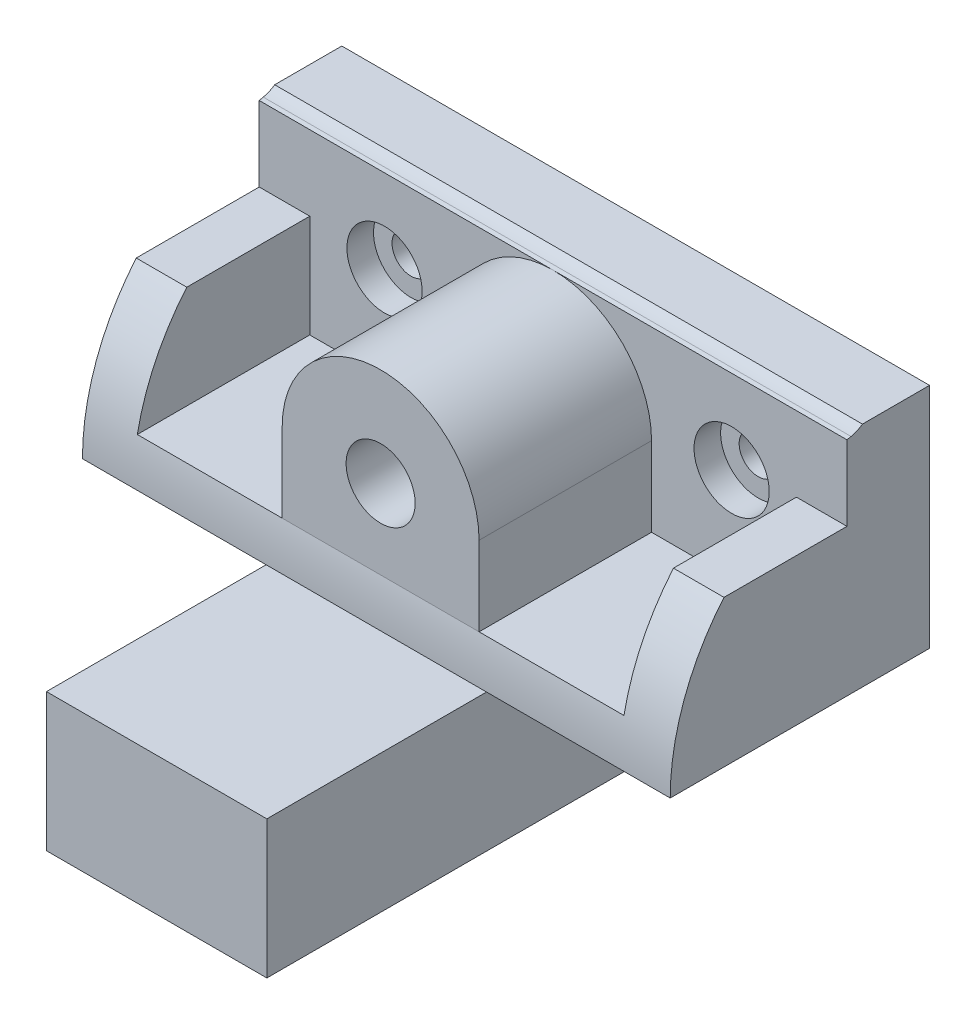
ISO-10303-21;
HEADER;
FILE_DESCRIPTION(('STEP AP214'),'2;1');
FILE_NAME('part.step','',(''),(''),'','','');
FILE_SCHEMA(('AUTOMOTIVE_DESIGN { 1 0 10303 214 1 1 1 1 }'));
ENDSEC;
DATA;
#1=APPLICATION_CONTEXT('core data for automotive mechanical design processes');
#2=APPLICATION_PROTOCOL_DEFINITION('international standard','automotive_design',2000,#1);
#3=PRODUCT_CONTEXT('',#1,'mechanical');
#4=PRODUCT('Part','Part','',(#3));
#5=PRODUCT_RELATED_PRODUCT_CATEGORY('part','',(#4));
#6=PRODUCT_DEFINITION_FORMATION('','',#4);
#7=PRODUCT_DEFINITION_CONTEXT('part definition',#1,'design');
#8=PRODUCT_DEFINITION('design','',#6,#7);
#9=PRODUCT_DEFINITION_SHAPE('','',#8);
#10=(LENGTH_UNIT() NAMED_UNIT(*) SI_UNIT(.MILLI.,.METRE.));
#11=(NAMED_UNIT(*) PLANE_ANGLE_UNIT() SI_UNIT($,.RADIAN.));
#12=(NAMED_UNIT(*) SI_UNIT($,.STERADIAN.) SOLID_ANGLE_UNIT());
#13=UNCERTAINTY_MEASURE_WITH_UNIT(LENGTH_MEASURE(1.E-05),#10,'distance_accuracy_value','');
#14=(GEOMETRIC_REPRESENTATION_CONTEXT(3) GLOBAL_UNCERTAINTY_ASSIGNED_CONTEXT((#13)) GLOBAL_UNIT_ASSIGNED_CONTEXT((#10,
#11,#12)) REPRESENTATION_CONTEXT('',''));
#15=CARTESIAN_POINT('',(0.,0.,0.));
#16=DIRECTION('',(0.,0.,1.));
#17=DIRECTION('',(1.,0.,0.));
#18=AXIS2_PLACEMENT_3D('',#15,#16,#17);
#19=CARTESIAN_POINT('',(101.6,0.,-39.3464684963495));
#20=DIRECTION('',(-1.,0.,0.));
#21=DIRECTION('',(0.,0.,1.));
#22=AXIS2_PLACEMENT_3D('',#19,#20,#21);
#23=CYLINDRICAL_SURFACE('',#22,39.3464684963495);
#24=DIRECTION('',(-1.,0.,0.));
#25=VECTOR('',#24,1.);
#26=CARTESIAN_POINT('',(101.6,25.4,-9.29676661539527));
#27=LINE('',#26,#25);
#28=CARTESIAN_POINT('',(92.8624,25.4,-9.29676661539527));
#29=VERTEX_POINT('',#28);
#30=CARTESIAN_POINT('',(101.6,25.4,-9.29676661539527));
#31=VERTEX_POINT('',#30);
#32=EDGE_CURVE('E475',#29,#31,#27,.F.);
#33=ORIENTED_EDGE('',*,*,#32,.F.);
#34=CARTESIAN_POINT('',(92.8624,0.,-39.3464684963495));
#35=DIRECTION('',(1.,0.,0.));
#36=DIRECTION('',(0.,0.,-1.));
#37=AXIS2_PLACEMENT_3D('',#34,#35,#36);
#38=CIRCLE('',#37,39.3464684963495);
#39=CARTESIAN_POINT('',(92.8624,7.61999999999997,-0.744911751391353));
#40=VERTEX_POINT('',#39);
#41=EDGE_CURVE('E196',#29,#40,#38,.T.);
#42=ORIENTED_EDGE('',*,*,#41,.T.);
#43=DIRECTION('',(-1.,0.,0.));
#44=VECTOR('',#43,1.);
#45=CARTESIAN_POINT('',(101.6,7.61999999999997,-0.744911751391353));
#46=LINE('',#45,#44);
#47=CARTESIAN_POINT('',(67.818,7.61999999999997,-0.744911751391353));
#48=VERTEX_POINT('',#47);
#49=EDGE_CURVE('E254',#40,#48,#46,.T.);
#50=ORIENTED_EDGE('',*,*,#49,.T.);
#51=DIRECTION('',(1.,0.,0.));
#52=VECTOR('',#51,1.);
#53=CARTESIAN_POINT('',(33.782,7.61999999999998,-0.744911751391353));
#54=LINE('',#53,#52);
#55=CARTESIAN_POINT('',(33.782,7.61999999999998,-0.744911751391353));
#56=VERTEX_POINT('',#55);
#57=EDGE_CURVE('E384',#56,#48,#54,.T.);
#58=ORIENTED_EDGE('',*,*,#57,.F.);
#59=CARTESIAN_POINT('',(8.73760000000001,7.61999999999997,-0.744911751391353));
#60=VERTEX_POINT('',#59);
#61=EDGE_CURVE('E256',#56,#60,#46,.T.);
#62=ORIENTED_EDGE('',*,*,#61,.T.);
#63=CARTESIAN_POINT('',(8.73760000000001,0.,-39.3464684963495));
#64=DIRECTION('',(-1.,0.,0.));
#65=DIRECTION('',(0.,0.,1.));
#66=AXIS2_PLACEMENT_3D('',#63,#64,#65);
#67=CIRCLE('',#66,39.3464684963495);
#68=CARTESIAN_POINT('',(8.73760000000001,25.4,-9.29676661539527));
#69=VERTEX_POINT('',#68);
#70=EDGE_CURVE('E246',#60,#69,#67,.T.);
#71=ORIENTED_EDGE('',*,*,#70,.T.);
#72=DIRECTION('',(-1.,0.,0.));
#73=VECTOR('',#72,1.);
#74=CARTESIAN_POINT('',(101.6,25.4,-9.29676661539527));
#75=LINE('',#74,#73);
#76=CARTESIAN_POINT('',(0.,25.4,-9.29676661539527));
#77=VERTEX_POINT('',#76);
#78=EDGE_CURVE('E48',#77,#69,#75,.F.);
#79=ORIENTED_EDGE('',*,*,#78,.F.);
#80=CARTESIAN_POINT('',(0.,0.,-39.3464684963495));
#81=DIRECTION('',(1.,0.,0.));
#82=DIRECTION('',(0.,0.,1.));
#83=AXIS2_PLACEMENT_3D('',#80,#81,#82);
#84=CIRCLE('',#83,39.3464684963495);
#85=CARTESIAN_POINT('',(0.,0.,0.));
#86=VERTEX_POINT('',#85);
#87=EDGE_CURVE('E203',#77,#86,#84,.T.);
#88=ORIENTED_EDGE('',*,*,#87,.T.);
#89=DIRECTION('',(-1.,0.,0.));
#90=VECTOR('',#89,1.);
#91=CARTESIAN_POINT('',(101.6,0.,0.));
#92=LINE('',#91,#90);
#93=CARTESIAN_POINT('',(31.75,0.,0.));
#94=VERTEX_POINT('',#93);
#95=EDGE_CURVE('E245',#94,#86,#92,.T.);
#96=ORIENTED_EDGE('',*,*,#95,.F.);
#97=CARTESIAN_POINT('',(69.85,0.,0.));
#98=VERTEX_POINT('',#97);
#99=EDGE_CURVE('E263',#98,#94,#92,.T.);
#100=ORIENTED_EDGE('',*,*,#99,.F.);
#101=CARTESIAN_POINT('',(101.6,0.,0.));
#102=VERTEX_POINT('',#101);
#103=EDGE_CURVE('E236',#102,#98,#92,.T.);
#104=ORIENTED_EDGE('',*,*,#103,.F.);
#105=CARTESIAN_POINT('',(101.6,0.,-39.3464684963495));
#106=DIRECTION('',(1.,0.,0.));
#107=DIRECTION('',(0.,0.,1.));
#108=AXIS2_PLACEMENT_3D('',#105,#106,#107);
#109=CIRCLE('',#108,39.3464684963495);
#110=EDGE_CURVE('E212',#31,#102,#109,.T.);
#111=ORIENTED_EDGE('',*,*,#110,.F.);
#112=EDGE_LOOP('',(#33,#42,#50,#58,#62,#71,#79,#88,#96,#100,#104,#111));
#113=FACE_BOUND('',#112,.T.);
#114=ADVANCED_FACE('F34',(#113),#23,.T.);
#115=DIRECTION('',(-1.,0.,0.));
#116=VECTOR('',#115,1.);
#117=CARTESIAN_POINT('',(101.6,38.3519981604129,-30.5562));
#118=LINE('',#117,#116);
#119=CARTESIAN_POINT('',(50.8,38.3519981604129,-30.5562));
#120=VERTEX_POINT('',#119);
#121=CARTESIAN_POINT('',(101.6,38.3519981604129,-30.5562000000001));
#122=VERTEX_POINT('',#121);
#123=EDGE_CURVE('E253',#120,#122,#118,.F.);
#124=ORIENTED_EDGE('',*,*,#123,.T.);
#125=CARTESIAN_POINT('',(101.6,38.5064,-31.2593341352654));
#126=VERTEX_POINT('',#125);
#127=EDGE_CURVE('E208',#126,#122,#109,.T.);
#128=ORIENTED_EDGE('',*,*,#127,.F.);
#129=DIRECTION('',(-1.,0.,0.));
#130=VECTOR('',#129,1.);
#131=CARTESIAN_POINT('',(101.6,38.5064,-31.2593341352654));
#132=LINE('',#131,#130);
#133=CARTESIAN_POINT('',(0.,38.5064,-31.2593341352654));
#134=VERTEX_POINT('',#133);
#135=EDGE_CURVE('E219',#126,#134,#132,.T.);
#136=ORIENTED_EDGE('',*,*,#135,.T.);
#137=CARTESIAN_POINT('',(0.,38.3519981604129,-30.5562));
#138=VERTEX_POINT('',#137);
#139=EDGE_CURVE('E220',#134,#138,#84,.T.);
#140=ORIENTED_EDGE('',*,*,#139,.T.);
#141=EDGE_CURVE('E250',#138,#120,#118,.F.);
#142=ORIENTED_EDGE('',*,*,#141,.T.);
#143=EDGE_LOOP('',(#124,#128,#136,#140,#142));
#144=FACE_BOUND('',#143,.T.);
#145=ADVANCED_FACE('F463',(#144),#23,.T.);
#146=CARTESIAN_POINT('',(101.6,0.,-39.3464684963495));
#147=DIRECTION('',(-1.,0.,0.));
#148=DIRECTION('',(0.,0.,1.));
#149=AXIS2_PLACEMENT_3D('',#146,#147,#148);
#150=PLANE('',#149);
#151=DIRECTION('',(0.,0.,1.));
#152=VECTOR('',#151,1.);
#153=CARTESIAN_POINT('',(101.6,25.4,-30.5562000000001));
#154=LINE('',#153,#152);
#155=CARTESIAN_POINT('',(101.6,25.4,-30.5562000000001));
#156=VERTEX_POINT('',#155);
#157=EDGE_CURVE('E183',#156,#31,#154,.T.);
#158=ORIENTED_EDGE('',*,*,#157,.T.);
#159=ORIENTED_EDGE('',*,*,#110,.T.);
#160=DIRECTION('',(0.,0.,-1.));
#161=VECTOR('',#160,1.);
#162=CARTESIAN_POINT('',(101.6,0.,0.));
#163=LINE('',#162,#161);
#164=CARTESIAN_POINT('',(101.6,0.,-44.831));
#165=VERTEX_POINT('',#164);
#166=EDGE_CURVE('E211',#102,#165,#163,.T.);
#167=ORIENTED_EDGE('',*,*,#166,.T.);
#168=DIRECTION('',(0.,1.,0.));
#169=VECTOR('',#168,1.);
#170=CARTESIAN_POINT('',(101.6,0.,-44.831));
#171=LINE('',#170,#169);
#172=CARTESIAN_POINT('',(101.6,39.37,-44.831));
#173=VERTEX_POINT('',#172);
#174=EDGE_CURVE('E214',#165,#173,#171,.T.);
#175=ORIENTED_EDGE('',*,*,#174,.T.);
#176=DIRECTION('',(0.,0.,1.));
#177=VECTOR('',#176,1.);
#178=CARTESIAN_POINT('',(101.6,39.37,-39.3464684963495));
#179=LINE('',#178,#177);
#180=CARTESIAN_POINT('',(101.6,39.37,-33.2291700065132));
#181=VERTEX_POINT('',#180);
#182=EDGE_CURVE('E360',#173,#181,#179,.T.);
#183=ORIENTED_EDGE('',*,*,#182,.T.);
#184=CARTESIAN_POINT('',(101.6,43.6476754525857,-30.1795607632441));
#185=DIRECTION('',(-1.,0.,0.));
#186=DIRECTION('',(0.,0.,-1.));
#187=AXIS2_PLACEMENT_3D('',#184,#185,#186);
#188=CIRCLE('',#187,5.25343923675592);
#189=EDGE_CURVE('E217',#181,#126,#188,.T.);
#190=ORIENTED_EDGE('',*,*,#189,.T.);
#191=ORIENTED_EDGE('',*,*,#127,.T.);
#192=DIRECTION('',(0.,-1.,0.));
#193=VECTOR('',#192,1.);
#194=CARTESIAN_POINT('',(101.6,38.3519981604129,-30.5562));
#195=LINE('',#194,#193);
#196=EDGE_CURVE('E474',#122,#156,#195,.T.);
#197=ORIENTED_EDGE('',*,*,#196,.T.);
#198=EDGE_LOOP('',(#158,#159,#167,#175,#183,#190,#191,#197));
#199=FACE_BOUND('',#198,.T.);
#200=ADVANCED_FACE('F359',(#199),#150,.F.);
#201=CARTESIAN_POINT('',(92.8624,7.61999999999997,0.));
#202=DIRECTION('',(1.,0.,0.));
#203=DIRECTION('',(0.,0.,-1.));
#204=AXIS2_PLACEMENT_3D('',#201,#202,#203);
#205=PLANE('',#204);
#206=DIRECTION('',(0.,0.,1.));
#207=VECTOR('',#206,1.);
#208=CARTESIAN_POINT('',(92.8624,25.4,0.));
#209=LINE('',#208,#207);
#210=CARTESIAN_POINT('',(92.8624,25.4,-30.5562));
#211=VERTEX_POINT('',#210);
#212=EDGE_CURVE('E11',#211,#29,#209,.T.);
#213=ORIENTED_EDGE('',*,*,#212,.F.);
#214=DIRECTION('',(0.,1.,0.));
#215=VECTOR('',#214,1.);
#216=CARTESIAN_POINT('',(92.8624,7.61999999999997,-30.5562));
#217=LINE('',#216,#215);
#218=CARTESIAN_POINT('',(92.8624,7.61999999999997,-30.5562));
#219=VERTEX_POINT('',#218);
#220=EDGE_CURVE('E194',#219,#211,#217,.T.);
#221=ORIENTED_EDGE('',*,*,#220,.F.);
#222=DIRECTION('',(0.,0.,-1.));
#223=VECTOR('',#222,1.);
#224=CARTESIAN_POINT('',(92.8624,7.61999999999997,0.));
#225=LINE('',#224,#223);
#226=EDGE_CURVE('E416',#40,#219,#225,.T.);
#227=ORIENTED_EDGE('',*,*,#226,.F.);
#228=ORIENTED_EDGE('',*,*,#41,.F.);
#229=EDGE_LOOP('',(#213,#221,#227,#228));
#230=FACE_BOUND('',#229,.T.);
#231=ADVANCED_FACE('F192',(#230),#205,.F.);
#232=CARTESIAN_POINT('',(0.,0.,-39.3464684963495));
#233=DIRECTION('',(-1.,0.,0.));
#234=DIRECTION('',(0.,0.,1.));
#235=AXIS2_PLACEMENT_3D('',#232,#233,#234);
#236=PLANE('',#235);
#237=DIRECTION('',(0.,0.,1.));
#238=VECTOR('',#237,1.);
#239=CARTESIAN_POINT('',(0.,25.4,-30.5562));
#240=LINE('',#239,#238);
#241=CARTESIAN_POINT('',(0.,25.4,-30.5562));
#242=VERTEX_POINT('',#241);
#243=EDGE_CURVE('E432',#242,#77,#240,.T.);
#244=ORIENTED_EDGE('',*,*,#243,.F.);
#245=DIRECTION('',(0.,-1.,0.));
#246=VECTOR('',#245,1.);
#247=CARTESIAN_POINT('',(0.,38.3519981604129,-30.5562));
#248=LINE('',#247,#246);
#249=EDGE_CURVE('E435',#138,#242,#248,.T.);
#250=ORIENTED_EDGE('',*,*,#249,.F.);
#251=ORIENTED_EDGE('',*,*,#139,.F.);
#252=CARTESIAN_POINT('',(0.,43.6476754525857,-30.1795607632441));
#253=DIRECTION('',(-1.,0.,0.));
#254=DIRECTION('',(0.,0.,-1.));
#255=AXIS2_PLACEMENT_3D('',#252,#253,#254);
#256=CIRCLE('',#255,5.25343923675592);
#257=CARTESIAN_POINT('',(0.,39.37,-33.2291700065132));
#258=VERTEX_POINT('',#257);
#259=EDGE_CURVE('E229',#258,#134,#256,.T.);
#260=ORIENTED_EDGE('',*,*,#259,.F.);
#261=DIRECTION('',(0.,0.,1.));
#262=VECTOR('',#261,1.);
#263=CARTESIAN_POINT('',(0.,39.37,-44.831));
#264=LINE('',#263,#262);
#265=CARTESIAN_POINT('',(0.,39.37,-44.831));
#266=VERTEX_POINT('',#265);
#267=EDGE_CURVE('E282',#266,#258,#264,.T.);
#268=ORIENTED_EDGE('',*,*,#267,.F.);
#269=DIRECTION('',(0.,1.,0.));
#270=VECTOR('',#269,1.);
#271=CARTESIAN_POINT('',(0.,0.,-44.831));
#272=LINE('',#271,#270);
#273=CARTESIAN_POINT('',(0.,0.,-44.831));
#274=VERTEX_POINT('',#273);
#275=EDGE_CURVE('E226',#274,#266,#272,.T.);
#276=ORIENTED_EDGE('',*,*,#275,.F.);
#277=DIRECTION('',(0.,0.,-1.));
#278=VECTOR('',#277,1.);
#279=CARTESIAN_POINT('',(0.,0.,0.));
#280=LINE('',#279,#278);
#281=EDGE_CURVE('E223',#86,#274,#280,.T.);
#282=ORIENTED_EDGE('',*,*,#281,.F.);
#283=ORIENTED_EDGE('',*,*,#87,.F.);
#284=EDGE_LOOP('',(#244,#250,#251,#260,#268,#276,#282,#283));
#285=FACE_BOUND('',#284,.T.);
#286=ADVANCED_FACE('F280',(#285),#236,.T.);
#287=CARTESIAN_POINT('',(8.73760000000001,7.61999999999997,0.));
#288=DIRECTION('',(-1.,0.,0.));
#289=DIRECTION('',(0.,0.,1.));
#290=AXIS2_PLACEMENT_3D('',#287,#288,#289);
#291=PLANE('',#290);
#292=DIRECTION('',(0.,0.,1.));
#293=VECTOR('',#292,1.);
#294=CARTESIAN_POINT('',(8.73760000000001,25.4,-30.5562));
#295=LINE('',#294,#293);
#296=CARTESIAN_POINT('',(8.73760000000001,25.4,-30.5562));
#297=VERTEX_POINT('',#296);
#298=EDGE_CURVE('E431',#297,#69,#295,.T.);
#299=ORIENTED_EDGE('',*,*,#298,.T.);
#300=ORIENTED_EDGE('',*,*,#70,.F.);
#301=DIRECTION('',(0.,0.,1.));
#302=VECTOR('',#301,1.);
#303=CARTESIAN_POINT('',(8.73760000000001,7.61999999999997,0.));
#304=LINE('',#303,#302);
#305=CARTESIAN_POINT('',(8.73760000000001,7.61999999999997,-30.5562));
#306=VERTEX_POINT('',#305);
#307=EDGE_CURVE('E414',#306,#60,#304,.T.);
#308=ORIENTED_EDGE('',*,*,#307,.F.);
#309=DIRECTION('',(0.,1.,0.));
#310=VECTOR('',#309,1.);
#311=CARTESIAN_POINT('',(8.73760000000001,7.61999999999997,-30.5562));
#312=LINE('',#311,#310);
#313=EDGE_CURVE('E200',#306,#297,#312,.T.);
#314=ORIENTED_EDGE('',*,*,#313,.T.);
#315=EDGE_LOOP('',(#299,#300,#308,#314));
#316=FACE_BOUND('',#315,.T.);
#317=ADVANCED_FACE('F430',(#316),#291,.F.);
#318=CARTESIAN_POINT('',(101.6,0.,0.));
#319=DIRECTION('',(0.,1.,0.));
#320=DIRECTION('',(0.,0.,1.));
#321=AXIS2_PLACEMENT_3D('',#318,#319,#320);
#322=PLANE('',#321);
#323=DIRECTION('',(0.,0.,-1.));
#324=VECTOR('',#323,1.);
#325=CARTESIAN_POINT('',(31.75,0.,37.973));
#326=LINE('',#325,#324);
#327=CARTESIAN_POINT('',(31.75,0.,-44.831));
#328=VERTEX_POINT('',#327);
#329=EDGE_CURVE('E41',#94,#328,#326,.T.);
#330=ORIENTED_EDGE('',*,*,#329,.F.);
#331=ORIENTED_EDGE('',*,*,#95,.T.);
#332=ORIENTED_EDGE('',*,*,#281,.T.);
#333=DIRECTION('',(-1.,0.,0.));
#334=VECTOR('',#333,1.);
#335=CARTESIAN_POINT('',(101.6,0.,-44.831));
#336=LINE('',#335,#334);
#337=EDGE_CURVE('E233',#328,#274,#336,.T.);
#338=ORIENTED_EDGE('',*,*,#337,.F.);
#339=EDGE_LOOP('',(#330,#331,#332,#338));
#340=FACE_BOUND('',#339,.T.);
#341=ADVANCED_FACE('F273',(#340),#322,.F.);
#342=CARTESIAN_POINT('',(8.73760000000001,7.61999999999997,-30.5562));
#343=DIRECTION('',(0.,0.,-1.));
#344=DIRECTION('',(-1.,0.,0.));
#345=AXIS2_PLACEMENT_3D('',#342,#343,#344);
#346=PLANE('',#345);
#347=CARTESIAN_POINT('',(81.6598930743401,23.8648844244175,-30.5562));
#348=DIRECTION('',(0.,0.,1.));
#349=DIRECTION('',(1.,0.,0.));
#350=AXIS2_PLACEMENT_3D('',#347,#348,#349);
#351=CIRCLE('',#350,6.49999999999999);
#352=CARTESIAN_POINT('',(88.1598930743401,23.8648844244175,-30.5562));
#353=VERTEX_POINT('',#352);
#354=EDGE_CURVE('E309',#353,#353,#351,.T.);
#355=ORIENTED_EDGE('',*,*,#354,.F.);
#356=EDGE_LOOP('',(#355));
#357=FACE_BOUND('',#356,.T.);
#358=DIRECTION('',(0.,1.,0.));
#359=VECTOR('',#358,1.);
#360=CARTESIAN_POINT('',(67.818,7.61999999999998,-30.5562));
#361=LINE('',#360,#359);
#362=CARTESIAN_POINT('',(67.818,7.61999999999997,-30.5562));
#363=VERTEX_POINT('',#362);
#364=CARTESIAN_POINT('',(67.818,21.3339981604129,-30.5562));
#365=VERTEX_POINT('',#364);
#366=EDGE_CURVE('E382',#363,#365,#361,.T.);
#367=ORIENTED_EDGE('',*,*,#366,.F.);
#368=DIRECTION('',(-1.,0.,0.));
#369=VECTOR('',#368,1.);
#370=CARTESIAN_POINT('',(8.73760000000001,7.61999999999997,-30.5562));
#371=LINE('',#370,#369);
#372=EDGE_CURVE('E199',#219,#363,#371,.T.);
#373=ORIENTED_EDGE('',*,*,#372,.F.);
#374=ORIENTED_EDGE('',*,*,#220,.T.);
#375=DIRECTION('',(-1.,0.,0.));
#376=VECTOR('',#375,1.);
#377=CARTESIAN_POINT('',(141.63166690155,25.4,-30.5562000000001));
#378=LINE('',#377,#376);
#379=EDGE_CURVE('E178',#156,#211,#378,.T.);
#380=ORIENTED_EDGE('',*,*,#379,.F.);
#381=ORIENTED_EDGE('',*,*,#196,.F.);
#382=ORIENTED_EDGE('',*,*,#123,.F.);
#383=CARTESIAN_POINT('',(50.8,21.3339981604129,-30.5562));
#384=DIRECTION('',(0.,0.,1.));
#385=DIRECTION('',(1.,0.,0.));
#386=AXIS2_PLACEMENT_3D('',#383,#384,#385);
#387=CIRCLE('',#386,17.018);
#388=EDGE_CURVE('E399',#365,#120,#387,.T.);
#389=ORIENTED_EDGE('',*,*,#388,.F.);
#390=EDGE_LOOP('',(#367,#373,#374,#380,#381,#382,#389));
#391=FACE_BOUND('',#390,.T.);
#392=ADVANCED_FACE('F197',(#357,#391),#346,.F.);
#393=CARTESIAN_POINT('',(21.6569926395346,23.8648844244175,-30.5562));
#394=DIRECTION('',(0.,0.,1.));
#395=DIRECTION('',(1.,0.,0.));
#396=AXIS2_PLACEMENT_3D('',#393,#394,#395);
#397=CIRCLE('',#396,6.5);
#398=CARTESIAN_POINT('',(28.1569926395346,23.8648844244175,-30.5562));
#399=VERTEX_POINT('',#398);
#400=EDGE_CURVE('E322',#399,#399,#397,.T.);
#401=ORIENTED_EDGE('',*,*,#400,.F.);
#402=EDGE_LOOP('',(#401));
#403=FACE_BOUND('',#402,.T.);
#404=CARTESIAN_POINT('',(33.782,21.3339981604129,-30.5562));
#405=VERTEX_POINT('',#404);
#406=EDGE_CURVE('E398',#120,#405,#387,.T.);
#407=ORIENTED_EDGE('',*,*,#406,.F.);
#408=ORIENTED_EDGE('',*,*,#141,.F.);
#409=ORIENTED_EDGE('',*,*,#249,.T.);
#410=DIRECTION('',(1.,0.,0.));
#411=VECTOR('',#410,1.);
#412=CARTESIAN_POINT('',(-26.7828626162363,25.4,-30.5562));
#413=LINE('',#412,#411);
#414=EDGE_CURVE('E428',#242,#297,#413,.T.);
#415=ORIENTED_EDGE('',*,*,#414,.T.);
#416=ORIENTED_EDGE('',*,*,#313,.F.);
#417=CARTESIAN_POINT('',(33.782,7.61999999999997,-30.5562));
#418=VERTEX_POINT('',#417);
#419=EDGE_CURVE('E205',#418,#306,#371,.T.);
#420=ORIENTED_EDGE('',*,*,#419,.F.);
#421=DIRECTION('',(0.,-1.,0.));
#422=VECTOR('',#421,1.);
#423=CARTESIAN_POINT('',(33.782,21.3339981604129,-30.5562));
#424=LINE('',#423,#422);
#425=EDGE_CURVE('E388',#405,#418,#424,.T.);
#426=ORIENTED_EDGE('',*,*,#425,.F.);
#427=EDGE_LOOP('',(#407,#408,#409,#415,#416,#420,#426));
#428=FACE_BOUND('',#427,.T.);
#429=ADVANCED_FACE('F426',(#403,#428),#346,.F.);
#430=CARTESIAN_POINT('',(0.,7.61999999999997,0.));
#431=DIRECTION('',(0.,-1.,0.));
#432=DIRECTION('',(0.,0.,-1.));
#433=AXIS2_PLACEMENT_3D('',#430,#431,#432);
#434=PLANE('',#433);
#435=DIRECTION('',(0.,0.,-1.));
#436=VECTOR('',#435,1.);
#437=CARTESIAN_POINT('',(67.818,7.61999999999998,-0.744911751391353));
#438=LINE('',#437,#436);
#439=EDGE_CURVE('E411',#48,#363,#438,.T.);
#440=ORIENTED_EDGE('',*,*,#439,.F.);
#441=ORIENTED_EDGE('',*,*,#49,.F.);
#442=ORIENTED_EDGE('',*,*,#226,.T.);
#443=ORIENTED_EDGE('',*,*,#372,.T.);
#444=EDGE_LOOP('',(#440,#441,#442,#443));
#445=FACE_BOUND('',#444,.T.);
#446=ADVANCED_FACE('F450',(#445),#434,.F.);
#447=DIRECTION('',(0.,0.,-1.));
#448=VECTOR('',#447,1.);
#449=CARTESIAN_POINT('',(33.782,7.61999999999998,-0.744911751391353));
#450=LINE('',#449,#448);
#451=EDGE_CURVE('E395',#56,#418,#450,.T.);
#452=ORIENTED_EDGE('',*,*,#451,.T.);
#453=ORIENTED_EDGE('',*,*,#419,.T.);
#454=ORIENTED_EDGE('',*,*,#307,.T.);
#455=ORIENTED_EDGE('',*,*,#61,.F.);
#456=EDGE_LOOP('',(#452,#453,#454,#455));
#457=FACE_BOUND('',#456,.T.);
#458=ADVANCED_FACE('F421',(#457),#434,.F.);
#459=ORIENTED_EDGE('',*,*,#103,.T.);
#460=DIRECTION('',(0.,0.,-1.));
#461=VECTOR('',#460,1.);
#462=CARTESIAN_POINT('',(69.85,0.,37.973));
#463=LINE('',#462,#461);
#464=CARTESIAN_POINT('',(69.85,0.,-44.831));
#465=VERTEX_POINT('',#464);
#466=EDGE_CURVE('E249',#98,#465,#463,.T.);
#467=ORIENTED_EDGE('',*,*,#466,.T.);
#468=EDGE_CURVE('E242',#165,#465,#336,.T.);
#469=ORIENTED_EDGE('',*,*,#468,.F.);
#470=ORIENTED_EDGE('',*,*,#166,.F.);
#471=EDGE_LOOP('',(#459,#467,#469,#470));
#472=FACE_BOUND('',#471,.T.);
#473=ADVANCED_FACE('F353',(#472),#322,.F.);
#474=CARTESIAN_POINT('',(101.6,0.,-44.831));
#475=DIRECTION('',(0.,0.,1.));
#476=DIRECTION('',(1.,0.,0.));
#477=AXIS2_PLACEMENT_3D('',#474,#475,#476);
#478=PLANE('',#477);
#479=CARTESIAN_POINT('',(21.6569926395346,23.8648844244175,-44.831));
#480=DIRECTION('',(0.,0.,1.));
#481=DIRECTION('',(1.,0.,0.));
#482=AXIS2_PLACEMENT_3D('',#479,#480,#481);
#483=CIRCLE('',#482,3.30000000000001);
#484=CARTESIAN_POINT('',(24.9569926395347,23.8648844244175,-44.831));
#485=VERTEX_POINT('',#484);
#486=EDGE_CURVE('E307',#485,#485,#483,.T.);
#487=ORIENTED_EDGE('',*,*,#486,.T.);
#488=EDGE_LOOP('',(#487));
#489=FACE_BOUND('',#488,.T.);
#490=CARTESIAN_POINT('',(81.6598930743401,23.8648844244175,-44.831));
#491=DIRECTION('',(0.,0.,1.));
#492=DIRECTION('',(1.,0.,0.));
#493=AXIS2_PLACEMENT_3D('',#490,#491,#492);
#494=CIRCLE('',#493,3.30000000000001);
#495=CARTESIAN_POINT('',(84.9598930743402,23.8648844244175,-44.831));
#496=VERTEX_POINT('',#495);
#497=EDGE_CURVE('E298',#496,#496,#494,.T.);
#498=ORIENTED_EDGE('',*,*,#497,.T.);
#499=EDGE_LOOP('',(#498));
#500=FACE_BOUND('',#499,.T.);
#501=ORIENTED_EDGE('',*,*,#275,.T.);
#502=DIRECTION('',(-1.,0.,0.));
#503=VECTOR('',#502,1.);
#504=CARTESIAN_POINT('',(101.600025,39.37,-44.831));
#505=LINE('',#504,#503);
#506=EDGE_CURVE('E56',#173,#266,#505,.T.);
#507=ORIENTED_EDGE('',*,*,#506,.F.);
#508=ORIENTED_EDGE('',*,*,#174,.F.);
#509=ORIENTED_EDGE('',*,*,#468,.T.);
#510=DIRECTION('',(0.,1.,0.));
#511=VECTOR('',#510,1.);
#512=CARTESIAN_POINT('',(69.85,-23.8252,-44.831));
#513=LINE('',#512,#511);
#514=CARTESIAN_POINT('',(69.85,-23.8252,-44.831));
#515=VERTEX_POINT('',#514);
#516=EDGE_CURVE('E294',#515,#465,#513,.T.);
#517=ORIENTED_EDGE('',*,*,#516,.F.);
#518=DIRECTION('',(-1.,0.,0.));
#519=VECTOR('',#518,1.);
#520=CARTESIAN_POINT('',(69.85,-23.8252,-44.831));
#521=LINE('',#520,#519);
#522=CARTESIAN_POINT('',(31.75,-23.8252,-44.831));
#523=VERTEX_POINT('',#522);
#524=EDGE_CURVE('E292',#515,#523,#521,.T.);
#525=ORIENTED_EDGE('',*,*,#524,.T.);
#526=DIRECTION('',(0.,1.,0.));
#527=VECTOR('',#526,1.);
#528=CARTESIAN_POINT('',(31.75,-23.8252,-44.831));
#529=LINE('',#528,#527);
#530=EDGE_CURVE('E289',#523,#328,#529,.T.);
#531=ORIENTED_EDGE('',*,*,#530,.T.);
#532=ORIENTED_EDGE('',*,*,#337,.T.);
#533=EDGE_LOOP('',(#501,#507,#508,#509,#517,#525,#531,#532));
#534=FACE_BOUND('',#533,.T.);
#535=ADVANCED_FACE('F284',(#489,#500,#534),#478,.F.);
#536=CARTESIAN_POINT('',(101.6,43.6476754525857,-30.1795607632441));
#537=DIRECTION('',(-1.,0.,0.));
#538=DIRECTION('',(0.,0.,1.));
#539=AXIS2_PLACEMENT_3D('',#536,#537,#538);
#540=CYLINDRICAL_SURFACE('',#539,5.25343923675592);
#541=ORIENTED_EDGE('',*,*,#189,.F.);
#542=DIRECTION('',(-1.,0.,0.));
#543=VECTOR('',#542,1.);
#544=CARTESIAN_POINT('',(101.6,39.37,-33.2291700065132));
#545=LINE('',#544,#543);
#546=EDGE_CURVE('E442',#181,#258,#545,.T.);
#547=ORIENTED_EDGE('',*,*,#546,.T.);
#548=ORIENTED_EDGE('',*,*,#259,.T.);
#549=ORIENTED_EDGE('',*,*,#135,.F.);
#550=EDGE_LOOP('',(#541,#547,#548,#549));
#551=FACE_BOUND('',#550,.T.);
#552=ADVANCED_FACE('F479',(#551),#540,.F.);
#553=CARTESIAN_POINT('',(50.8,21.3339981604129,-0.744911751391353));
#554=DIRECTION('',(0.,0.,1.));
#555=DIRECTION('',(1.,0.,0.));
#556=AXIS2_PLACEMENT_3D('',#553,#554,#555);
#557=PLANE('',#556);
#558=ORIENTED_EDGE('',*,*,#57,.T.);
#559=DIRECTION('',(0.,1.,0.));
#560=VECTOR('',#559,1.);
#561=CARTESIAN_POINT('',(67.818,7.61999999999998,-0.744911751391353));
#562=LINE('',#561,#560);
#563=CARTESIAN_POINT('',(67.818,21.3339981604129,-0.744911751391353));
#564=VERTEX_POINT('',#563);
#565=EDGE_CURVE('E387',#48,#564,#562,.T.);
#566=ORIENTED_EDGE('',*,*,#565,.T.);
#567=CARTESIAN_POINT('',(50.8,21.3339981604129,-0.744911751391353));
#568=DIRECTION('',(0.,0.,1.));
#569=DIRECTION('',(1.,0.,0.));
#570=AXIS2_PLACEMENT_3D('',#567,#568,#569);
#571=CIRCLE('',#570,17.018);
#572=CARTESIAN_POINT('',(33.782,21.3339981604129,-0.744911751391353));
#573=VERTEX_POINT('',#572);
#574=EDGE_CURVE('E390',#564,#573,#571,.T.);
#575=ORIENTED_EDGE('',*,*,#574,.T.);
#576=DIRECTION('',(0.,-1.,0.));
#577=VECTOR('',#576,1.);
#578=CARTESIAN_POINT('',(33.782,21.3339981604129,-0.744911751391353));
#579=LINE('',#578,#577);
#580=EDGE_CURVE('E392',#573,#56,#579,.T.);
#581=ORIENTED_EDGE('',*,*,#580,.T.);
#582=EDGE_LOOP('',(#558,#566,#575,#581));
#583=FACE_BOUND('',#582,.T.);
#584=CARTESIAN_POINT('',(50.8,21.3339981604129,-0.744911751391353));
#585=DIRECTION('',(0.,0.,1.));
#586=DIRECTION('',(1.,0.,0.));
#587=AXIS2_PLACEMENT_3D('',#584,#585,#586);
#588=CIRCLE('',#587,5.969);
#589=CARTESIAN_POINT('',(56.769,21.3339981604129,-0.744911751391353));
#590=VERTEX_POINT('',#589);
#591=EDGE_CURVE('E377',#590,#590,#588,.T.);
#592=ORIENTED_EDGE('',*,*,#591,.F.);
#593=EDGE_LOOP('',(#592));
#594=FACE_BOUND('',#593,.T.);
#595=ADVANCED_FACE('F490',(#583,#594),#557,.T.);
#596=CARTESIAN_POINT('',(67.818,7.61999999999998,-0.744911751391353));
#597=DIRECTION('',(-1.,0.,0.));
#598=DIRECTION('',(0.,-1.,0.));
#599=AXIS2_PLACEMENT_3D('',#596,#597,#598);
#600=PLANE('',#599);
#601=ORIENTED_EDGE('',*,*,#366,.T.);
#602=DIRECTION('',(0.,0.,-1.));
#603=VECTOR('',#602,1.);
#604=CARTESIAN_POINT('',(67.818,21.3339981604129,-0.744911751391353));
#605=LINE('',#604,#603);
#606=EDGE_CURVE('E408',#564,#365,#605,.T.);
#607=ORIENTED_EDGE('',*,*,#606,.F.);
#608=ORIENTED_EDGE('',*,*,#565,.F.);
#609=ORIENTED_EDGE('',*,*,#439,.T.);
#610=EDGE_LOOP('',(#601,#607,#608,#609));
#611=FACE_BOUND('',#610,.T.);
#612=ADVANCED_FACE('F486',(#611),#600,.F.);
#613=CARTESIAN_POINT('',(50.8,21.3339981604129,-0.744911751391353));
#614=DIRECTION('',(0.,0.,-1.));
#615=DIRECTION('',(-1.,0.,0.));
#616=AXIS2_PLACEMENT_3D('',#613,#614,#615);
#617=CYLINDRICAL_SURFACE('',#616,17.018);
#618=ORIENTED_EDGE('',*,*,#388,.T.);
#619=ORIENTED_EDGE('',*,*,#406,.T.);
#620=DIRECTION('',(0.,0.,-1.));
#621=VECTOR('',#620,1.);
#622=CARTESIAN_POINT('',(33.782,21.3339981604129,-0.744911751391353));
#623=LINE('',#622,#621);
#624=EDGE_CURVE('E405',#573,#405,#623,.T.);
#625=ORIENTED_EDGE('',*,*,#624,.F.);
#626=ORIENTED_EDGE('',*,*,#574,.F.);
#627=ORIENTED_EDGE('',*,*,#606,.T.);
#628=EDGE_LOOP('',(#618,#619,#625,#626,#627));
#629=FACE_BOUND('',#628,.T.);
#630=ADVANCED_FACE('F498',(#629),#617,.T.);
#631=CARTESIAN_POINT('',(33.782,21.3339981604129,-0.744911751391353));
#632=DIRECTION('',(1.,0.,0.));
#633=DIRECTION('',(0.,1.,0.));
#634=AXIS2_PLACEMENT_3D('',#631,#632,#633);
#635=PLANE('',#634);
#636=ORIENTED_EDGE('',*,*,#425,.T.);
#637=ORIENTED_EDGE('',*,*,#451,.F.);
#638=ORIENTED_EDGE('',*,*,#580,.F.);
#639=ORIENTED_EDGE('',*,*,#624,.T.);
#640=EDGE_LOOP('',(#636,#637,#638,#639));
#641=FACE_BOUND('',#640,.T.);
#642=ADVANCED_FACE('F495',(#641),#635,.F.);
#643=CARTESIAN_POINT('',(50.8,21.3339981604129,-0.744911751391353));
#644=DIRECTION('',(0.,0.,-1.));
#645=DIRECTION('',(-1.,0.,0.));
#646=AXIS2_PLACEMENT_3D('',#643,#644,#645);
#647=CYLINDRICAL_SURFACE('',#646,5.969);
#648=ORIENTED_EDGE('',*,*,#591,.T.);
#649=EDGE_LOOP('',(#648));
#650=FACE_BOUND('',#649,.T.);
#651=CARTESIAN_POINT('',(50.8,21.3339981604129,-30.5562));
#652=DIRECTION('',(0.,0.,1.));
#653=DIRECTION('',(1.,0.,0.));
#654=AXIS2_PLACEMENT_3D('',#651,#652,#653);
#655=CIRCLE('',#654,5.969);
#656=CARTESIAN_POINT('',(56.769,21.3339981604129,-30.5562));
#657=VERTEX_POINT('',#656);
#658=EDGE_CURVE('E375',#657,#657,#655,.T.);
#659=ORIENTED_EDGE('',*,*,#658,.F.);
#660=EDGE_LOOP('',(#659));
#661=FACE_BOUND('',#660,.T.);
#662=ADVANCED_FACE('F461',(#650,#661),#647,.F.);
#663=ORIENTED_EDGE('',*,*,#658,.T.);
#664=EDGE_LOOP('',(#663));
#665=FACE_BOUND('',#664,.T.);
#666=ADVANCED_FACE('F452',(#665),#346,.F.);
#667=CARTESIAN_POINT('',(69.85,0.,37.973));
#668=DIRECTION('',(0.,-1.,0.));
#669=DIRECTION('',(1.,0.,0.));
#670=AXIS2_PLACEMENT_3D('',#667,#668,#669);
#671=PLANE('',#670);
#672=CARTESIAN_POINT('',(69.85,0.,37.973));
#673=VERTEX_POINT('',#672);
#674=EDGE_CURVE('E348',#673,#98,#463,.T.);
#675=ORIENTED_EDGE('',*,*,#674,.T.);
#676=ORIENTED_EDGE('',*,*,#99,.T.);
#677=CARTESIAN_POINT('',(31.75,0.,37.973));
#678=VERTEX_POINT('',#677);
#679=EDGE_CURVE('E344',#678,#94,#326,.T.);
#680=ORIENTED_EDGE('',*,*,#679,.F.);
#681=DIRECTION('',(-1.,0.,0.));
#682=VECTOR('',#681,1.);
#683=CARTESIAN_POINT('',(69.85,0.,37.973));
#684=LINE('',#683,#682);
#685=EDGE_CURVE('E332',#673,#678,#684,.T.);
#686=ORIENTED_EDGE('',*,*,#685,.F.);
#687=EDGE_LOOP('',(#675,#676,#680,#686));
#688=FACE_BOUND('',#687,.T.);
#689=ADVANCED_FACE('F365',(#688),#671,.F.);
#690=CARTESIAN_POINT('',(69.85,-23.8252,37.973));
#691=DIRECTION('',(-1.,0.,0.));
#692=DIRECTION('',(0.,-1.,0.));
#693=AXIS2_PLACEMENT_3D('',#690,#691,#692);
#694=PLANE('',#693);
#695=ORIENTED_EDGE('',*,*,#516,.T.);
#696=ORIENTED_EDGE('',*,*,#466,.F.);
#697=ORIENTED_EDGE('',*,*,#674,.F.);
#698=DIRECTION('',(0.,1.,0.));
#699=VECTOR('',#698,1.);
#700=CARTESIAN_POINT('',(69.85,-23.8252,37.973));
#701=LINE('',#700,#699);
#702=CARTESIAN_POINT('',(69.85,-23.8252,37.973));
#703=VERTEX_POINT('',#702);
#704=EDGE_CURVE('E296',#703,#673,#701,.T.);
#705=ORIENTED_EDGE('',*,*,#704,.F.);
#706=DIRECTION('',(0.,0.,-1.));
#707=VECTOR('',#706,1.);
#708=CARTESIAN_POINT('',(69.85,-23.8252,37.973));
#709=LINE('',#708,#707);
#710=EDGE_CURVE('E339',#703,#515,#709,.T.);
#711=ORIENTED_EDGE('',*,*,#710,.T.);
#712=EDGE_LOOP('',(#695,#696,#697,#705,#711));
#713=FACE_BOUND('',#712,.T.);
#714=ADVANCED_FACE('F374',(#713),#694,.F.);
#715=CARTESIAN_POINT('',(31.75,-23.8252,37.973));
#716=DIRECTION('',(-1.,0.,0.));
#717=DIRECTION('',(0.,0.,1.));
#718=AXIS2_PLACEMENT_3D('',#715,#716,#717);
#719=PLANE('',#718);
#720=ORIENTED_EDGE('',*,*,#530,.F.);
#721=DIRECTION('',(0.,0.,-1.));
#722=VECTOR('',#721,1.);
#723=CARTESIAN_POINT('',(31.75,-23.8252,37.973));
#724=LINE('',#723,#722);
#725=CARTESIAN_POINT('',(31.75,-23.8252,37.973));
#726=VERTEX_POINT('',#725);
#727=EDGE_CURVE('E342',#726,#523,#724,.T.);
#728=ORIENTED_EDGE('',*,*,#727,.F.);
#729=DIRECTION('',(0.,1.,0.));
#730=VECTOR('',#729,1.);
#731=CARTESIAN_POINT('',(31.75,-23.8252,37.973));
#732=LINE('',#731,#730);
#733=EDGE_CURVE('E334',#726,#678,#732,.T.);
#734=ORIENTED_EDGE('',*,*,#733,.T.);
#735=ORIENTED_EDGE('',*,*,#679,.T.);
#736=ORIENTED_EDGE('',*,*,#329,.T.);
#737=EDGE_LOOP('',(#720,#728,#734,#735,#736));
#738=FACE_BOUND('',#737,.T.);
#739=ADVANCED_FACE('F366',(#738),#719,.T.);
#740=CARTESIAN_POINT('',(69.85,-23.8252,37.973));
#741=DIRECTION('',(0.,-1.,0.));
#742=DIRECTION('',(1.,0.,0.));
#743=AXIS2_PLACEMENT_3D('',#740,#741,#742);
#744=PLANE('',#743);
#745=ORIENTED_EDGE('',*,*,#524,.F.);
#746=ORIENTED_EDGE('',*,*,#710,.F.);
#747=DIRECTION('',(-1.,0.,0.));
#748=VECTOR('',#747,1.);
#749=CARTESIAN_POINT('',(69.85,-23.8252,37.973));
#750=LINE('',#749,#748);
#751=EDGE_CURVE('E337',#703,#726,#750,.T.);
#752=ORIENTED_EDGE('',*,*,#751,.T.);
#753=ORIENTED_EDGE('',*,*,#727,.T.);
#754=EDGE_LOOP('',(#745,#746,#752,#753));
#755=FACE_BOUND('',#754,.T.);
#756=ADVANCED_FACE('F372',(#755),#744,.T.);
#757=CARTESIAN_POINT('',(0.,0.,37.973));
#758=DIRECTION('',(0.,0.,1.));
#759=DIRECTION('',(1.,0.,0.));
#760=AXIS2_PLACEMENT_3D('',#757,#758,#759);
#761=PLANE('',#760);
#762=ORIENTED_EDGE('',*,*,#704,.T.);
#763=ORIENTED_EDGE('',*,*,#685,.T.);
#764=ORIENTED_EDGE('',*,*,#733,.F.);
#765=ORIENTED_EDGE('',*,*,#751,.F.);
#766=EDGE_LOOP('',(#762,#763,#764,#765));
#767=FACE_BOUND('',#766,.T.);
#768=ADVANCED_FACE('F370',(#767),#761,.T.);
#769=CARTESIAN_POINT('',(81.6598930743401,23.8648844244175,-30.5562));
#770=DIRECTION('',(0.,0.,1.));
#771=DIRECTION('',(1.,0.,0.));
#772=AXIS2_PLACEMENT_3D('',#769,#770,#771);
#773=CYLINDRICAL_SURFACE('',#772,3.30000000000001);
#774=CARTESIAN_POINT('',(81.6598930743401,23.8648844244175,-35.1562));
#775=DIRECTION('',(0.,0.,1.));
#776=DIRECTION('',(1.,0.,0.));
#777=AXIS2_PLACEMENT_3D('',#774,#775,#776);
#778=CIRCLE('',#777,3.30000000000001);
#779=CARTESIAN_POINT('',(84.9598930743402,23.8648844244175,-35.1562));
#780=VERTEX_POINT('',#779);
#781=EDGE_CURVE('E306',#780,#780,#778,.T.);
#782=ORIENTED_EDGE('',*,*,#781,.T.);
#783=EDGE_LOOP('',(#782));
#784=FACE_BOUND('',#783,.T.);
#785=ORIENTED_EDGE('',*,*,#497,.F.);
#786=EDGE_LOOP('',(#785));
#787=FACE_BOUND('',#786,.T.);
#788=ADVANCED_FACE('F523',(#784,#787),#773,.F.);
#789=CARTESIAN_POINT('',(84.9598930743402,23.8648844244175,-35.1562));
#790=DIRECTION('',(0.,0.,-1.));
#791=DIRECTION('',(-1.,0.,0.));
#792=AXIS2_PLACEMENT_3D('',#789,#790,#791);
#793=PLANE('',#792);
#794=ORIENTED_EDGE('',*,*,#781,.F.);
#795=EDGE_LOOP('',(#794));
#796=FACE_BOUND('',#795,.T.);
#797=CARTESIAN_POINT('',(81.6598930743401,23.8648844244175,-35.1562));
#798=DIRECTION('',(0.,0.,1.));
#799=DIRECTION('',(1.,0.,0.));
#800=AXIS2_PLACEMENT_3D('',#797,#798,#799);
#801=CIRCLE('',#800,6.49999999999999);
#802=CARTESIAN_POINT('',(88.1598930743401,23.8648844244175,-35.1562));
#803=VERTEX_POINT('',#802);
#804=EDGE_CURVE('E314',#803,#803,#801,.T.);
#805=ORIENTED_EDGE('',*,*,#804,.T.);
#806=EDGE_LOOP('',(#805));
#807=FACE_BOUND('',#806,.T.);
#808=ADVANCED_FACE('F526',(#796,#807),#793,.F.);
#809=CARTESIAN_POINT('',(81.6598930743401,23.8648844244175,-30.5562));
#810=DIRECTION('',(0.,0.,1.));
#811=DIRECTION('',(1.,0.,0.));
#812=AXIS2_PLACEMENT_3D('',#809,#810,#811);
#813=CYLINDRICAL_SURFACE('',#812,6.49999999999999);
#814=ORIENTED_EDGE('',*,*,#804,.F.);
#815=EDGE_LOOP('',(#814));
#816=FACE_BOUND('',#815,.T.);
#817=ORIENTED_EDGE('',*,*,#354,.T.);
#818=EDGE_LOOP('',(#817));
#819=FACE_BOUND('',#818,.T.);
#820=ADVANCED_FACE('F530',(#816,#819),#813,.F.);
#821=CARTESIAN_POINT('',(21.6569926395346,23.8648844244175,-30.5562));
#822=DIRECTION('',(0.,0.,1.));
#823=DIRECTION('',(1.,0.,0.));
#824=AXIS2_PLACEMENT_3D('',#821,#822,#823);
#825=CYLINDRICAL_SURFACE('',#824,3.30000000000001);
#826=CARTESIAN_POINT('',(21.6569926395346,23.8648844244175,-35.1562));
#827=DIRECTION('',(0.,0.,1.));
#828=DIRECTION('',(1.,0.,0.));
#829=AXIS2_PLACEMENT_3D('',#826,#827,#828);
#830=CIRCLE('',#829,3.30000000000001);
#831=CARTESIAN_POINT('',(24.9569926395347,23.8648844244175,-35.1562));
#832=VERTEX_POINT('',#831);
#833=EDGE_CURVE('E310',#832,#832,#830,.T.);
#834=ORIENTED_EDGE('',*,*,#833,.T.);
#835=EDGE_LOOP('',(#834));
#836=FACE_BOUND('',#835,.T.);
#837=ORIENTED_EDGE('',*,*,#486,.F.);
#838=EDGE_LOOP('',(#837));
#839=FACE_BOUND('',#838,.T.);
#840=ADVANCED_FACE('F534',(#836,#839),#825,.F.);
#841=CARTESIAN_POINT('',(24.9569926395347,23.8648844244175,-35.1562));
#842=DIRECTION('',(0.,0.,-1.));
#843=DIRECTION('',(-1.,0.,0.));
#844=AXIS2_PLACEMENT_3D('',#841,#842,#843);
#845=PLANE('',#844);
#846=ORIENTED_EDGE('',*,*,#833,.F.);
#847=EDGE_LOOP('',(#846));
#848=FACE_BOUND('',#847,.T.);
#849=CARTESIAN_POINT('',(21.6569926395346,23.8648844244175,-35.1562));
#850=DIRECTION('',(0.,0.,1.));
#851=DIRECTION('',(1.,0.,0.));
#852=AXIS2_PLACEMENT_3D('',#849,#850,#851);
#853=CIRCLE('',#852,6.5);
#854=CARTESIAN_POINT('',(28.1569926395346,23.8648844244175,-35.1562));
#855=VERTEX_POINT('',#854);
#856=EDGE_CURVE('E317',#855,#855,#853,.T.);
#857=ORIENTED_EDGE('',*,*,#856,.T.);
#858=EDGE_LOOP('',(#857));
#859=FACE_BOUND('',#858,.T.);
#860=ADVANCED_FACE('F538',(#848,#859),#845,.F.);
#861=CARTESIAN_POINT('',(21.6569926395346,23.8648844244175,-30.5562));
#862=DIRECTION('',(0.,0.,1.));
#863=DIRECTION('',(1.,0.,0.));
#864=AXIS2_PLACEMENT_3D('',#861,#862,#863);
#865=CYLINDRICAL_SURFACE('',#864,6.5);
#866=ORIENTED_EDGE('',*,*,#856,.F.);
#867=EDGE_LOOP('',(#866));
#868=FACE_BOUND('',#867,.T.);
#869=ORIENTED_EDGE('',*,*,#400,.T.);
#870=EDGE_LOOP('',(#869));
#871=FACE_BOUND('',#870,.T.);
#872=ADVANCED_FACE('F447',(#868,#871),#865,.F.);
#873=CARTESIAN_POINT('',(101.600025,39.37,-44.831));
#874=DIRECTION('',(0.,-1.,0.));
#875=DIRECTION('',(0.,0.,-1.));
#876=AXIS2_PLACEMENT_3D('',#873,#874,#875);
#877=PLANE('',#876);
#878=ORIENTED_EDGE('',*,*,#182,.F.);
#879=ORIENTED_EDGE('',*,*,#506,.T.);
#880=ORIENTED_EDGE('',*,*,#267,.T.);
#881=ORIENTED_EDGE('',*,*,#546,.F.);
#882=EDGE_LOOP('',(#878,#879,#880,#881));
#883=FACE_BOUND('',#882,.T.);
#884=ADVANCED_FACE('F544',(#883),#877,.F.);
#885=CARTESIAN_POINT('',(-26.7828626162363,25.4,-30.5562));
#886=DIRECTION('',(0.,1.,0.));
#887=DIRECTION('',(0.,0.,1.));
#888=AXIS2_PLACEMENT_3D('',#885,#886,#887);
#889=PLANE('',#888);
#890=ORIENTED_EDGE('',*,*,#78,.T.);
#891=ORIENTED_EDGE('',*,*,#298,.F.);
#892=ORIENTED_EDGE('',*,*,#414,.F.);
#893=ORIENTED_EDGE('',*,*,#243,.T.);
#894=EDGE_LOOP('',(#890,#891,#892,#893));
#895=FACE_BOUND('',#894,.T.);
#896=ADVANCED_FACE('F548',(#895),#889,.T.);
#897=CARTESIAN_POINT('',(141.63166690155,25.4,-30.5562000000001));
#898=DIRECTION('',(0.,1.,0.));
#899=DIRECTION('',(0.,0.,1.));
#900=AXIS2_PLACEMENT_3D('',#897,#898,#899);
#901=PLANE('',#900);
#902=ORIENTED_EDGE('',*,*,#32,.T.);
#903=ORIENTED_EDGE('',*,*,#157,.F.);
#904=ORIENTED_EDGE('',*,*,#379,.T.);
#905=ORIENTED_EDGE('',*,*,#212,.T.);
#906=EDGE_LOOP('',(#902,#903,#904,#905));
#907=FACE_BOUND('',#906,.T.);
#908=ADVANCED_FACE('F180',(#907),#901,.T.);
#909=CLOSED_SHELL('',(#114,#145,#200,#231,#286,#317,#341,#392,#429,#446,#458,#473,#535,#552,
#595,#612,#630,#642,#662,#666,#689,#714,#739,#756,#768,#788,#808,#820,#840,#860,#872,#884,#896,#908));
#910=MANIFOLD_SOLID_BREP('B2',#909);
#911=ADVANCED_BREP_SHAPE_REPRESENTATION('',(#18,#910),#14);
#912=SHAPE_DEFINITION_REPRESENTATION(#9,#911);
ENDSEC;
END-ISO-10303-21;
